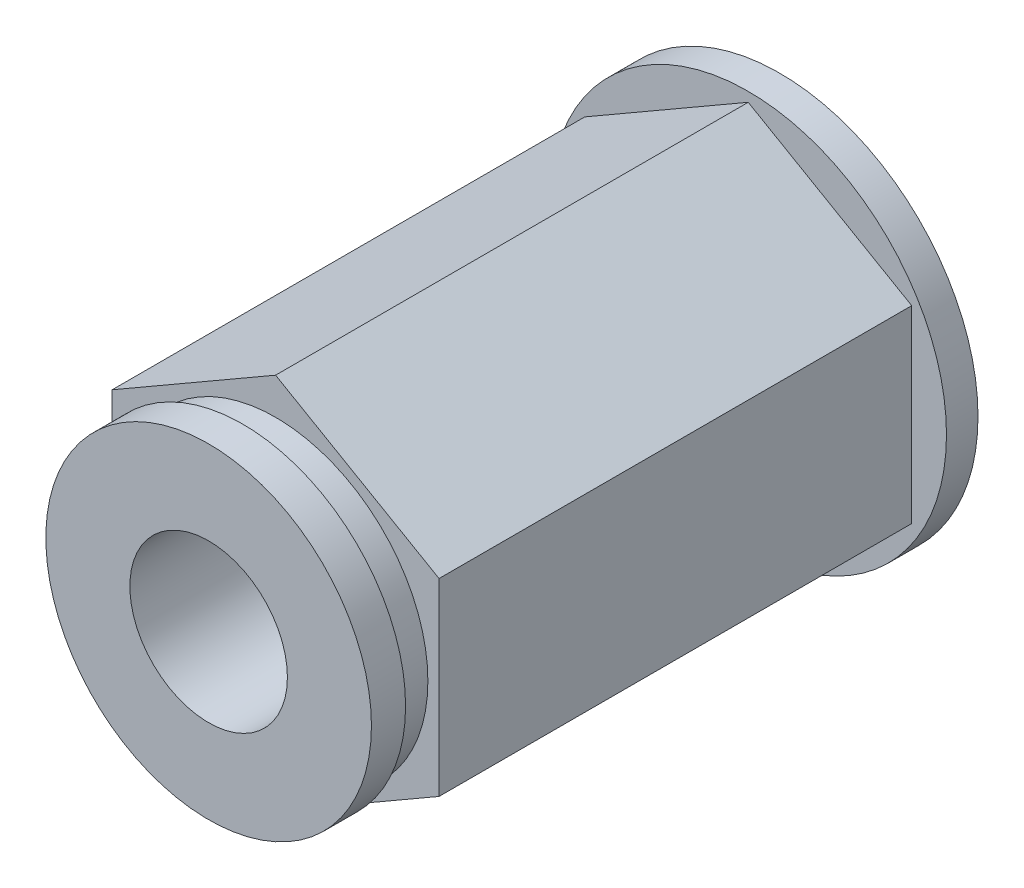
ISO-10303-21;
HEADER;
FILE_DESCRIPTION(('STEP AP214'),'2;1');
FILE_NAME('part.step','',(''),(''),'','','');
FILE_SCHEMA(('AUTOMOTIVE_DESIGN { 1 0 10303 214 1 1 1 1 }'));
ENDSEC;
DATA;
#1=APPLICATION_CONTEXT('core data for automotive mechanical design processes');
#2=APPLICATION_PROTOCOL_DEFINITION('international standard','automotive_design',2000,#1);
#3=PRODUCT_CONTEXT('',#1,'mechanical');
#4=PRODUCT('Part','Part','',(#3));
#5=PRODUCT_RELATED_PRODUCT_CATEGORY('part','',(#4));
#6=PRODUCT_DEFINITION_FORMATION('','',#4);
#7=PRODUCT_DEFINITION_CONTEXT('part definition',#1,'design');
#8=PRODUCT_DEFINITION('design','',#6,#7);
#9=PRODUCT_DEFINITION_SHAPE('','',#8);
#10=(LENGTH_UNIT() NAMED_UNIT(*) SI_UNIT(.MILLI.,.METRE.));
#11=(NAMED_UNIT(*) PLANE_ANGLE_UNIT() SI_UNIT($,.RADIAN.));
#12=(NAMED_UNIT(*) SI_UNIT($,.STERADIAN.) SOLID_ANGLE_UNIT());
#13=UNCERTAINTY_MEASURE_WITH_UNIT(LENGTH_MEASURE(1.E-05),#10,'distance_accuracy_value','');
#14=(GEOMETRIC_REPRESENTATION_CONTEXT(3) GLOBAL_UNCERTAINTY_ASSIGNED_CONTEXT((#13)) GLOBAL_UNIT_ASSIGNED_CONTEXT((#10,
#11,#12)) REPRESENTATION_CONTEXT('',''));
#15=CARTESIAN_POINT('',(0.,0.,0.));
#16=DIRECTION('',(0.,0.,1.));
#17=DIRECTION('',(1.,0.,0.));
#18=AXIS2_PLACEMENT_3D('',#15,#16,#17);
#19=CARTESIAN_POINT('',(6.225,-3.59400542570542,19.2));
#20=DIRECTION('',(0.,0.,1.));
#21=DIRECTION('',(1.,0.,0.));
#22=AXIS2_PLACEMENT_3D('',#19,#20,#21);
#23=PLANE('',#22);
#24=DIRECTION('',(0.866025403784439,0.5,0.));
#25=VECTOR('',#24,1.);
#26=CARTESIAN_POINT('',(0.,-7.18801085141084,19.2));
#27=LINE('',#26,#25);
#28=CARTESIAN_POINT('',(0.,-7.18801085141084,19.2));
#29=VERTEX_POINT('',#28);
#30=CARTESIAN_POINT('',(6.225,-3.59400542570542,19.2));
#31=VERTEX_POINT('',#30);
#32=EDGE_CURVE('E129',#29,#31,#27,.T.);
#33=ORIENTED_EDGE('',*,*,#32,.T.);
#34=DIRECTION('',(0.,1.,0.));
#35=VECTOR('',#34,1.);
#36=CARTESIAN_POINT('',(6.225,-3.59400542570542,19.2));
#37=LINE('',#36,#35);
#38=CARTESIAN_POINT('',(6.225,3.59400542570543,19.2));
#39=VERTEX_POINT('',#38);
#40=EDGE_CURVE('E84',#31,#39,#37,.T.);
#41=ORIENTED_EDGE('',*,*,#40,.T.);
#42=DIRECTION('',(-0.866025403784439,0.5,0.));
#43=VECTOR('',#42,1.);
#44=CARTESIAN_POINT('',(6.225,3.59400542570543,19.2));
#45=LINE('',#44,#43);
#46=CARTESIAN_POINT('',(0.,7.18801085141084,19.2));
#47=VERTEX_POINT('',#46);
#48=EDGE_CURVE('E97',#39,#47,#45,.T.);
#49=ORIENTED_EDGE('',*,*,#48,.T.);
#50=DIRECTION('',(-0.866025403784439,-0.5,0.));
#51=VECTOR('',#50,1.);
#52=CARTESIAN_POINT('',(0.,7.18801085141084,19.2));
#53=LINE('',#52,#51);
#54=CARTESIAN_POINT('',(-6.225,3.59400542570542,19.2));
#55=VERTEX_POINT('',#54);
#56=EDGE_CURVE('E91',#47,#55,#53,.T.);
#57=ORIENTED_EDGE('',*,*,#56,.T.);
#58=DIRECTION('',(0.,-1.,0.));
#59=VECTOR('',#58,1.);
#60=CARTESIAN_POINT('',(-6.225,3.59400542570542,19.2));
#61=LINE('',#60,#59);
#62=CARTESIAN_POINT('',(-6.225,-3.59400542570542,19.2));
#63=VERTEX_POINT('',#62);
#64=EDGE_CURVE('E95',#55,#63,#61,.T.);
#65=ORIENTED_EDGE('',*,*,#64,.T.);
#66=DIRECTION('',(0.866025403784438,-0.5,0.));
#67=VECTOR('',#66,1.);
#68=CARTESIAN_POINT('',(-6.225,-3.59400542570542,19.2));
#69=LINE('',#68,#67);
#70=EDGE_CURVE('E56',#63,#29,#69,.T.);
#71=ORIENTED_EDGE('',*,*,#70,.T.);
#72=EDGE_LOOP('',(#33,#41,#49,#57,#65,#71));
#73=FACE_BOUND('',#72,.T.);
#74=CARTESIAN_POINT('',(0.,0.,19.2));
#75=DIRECTION('',(0.,0.,1.));
#76=DIRECTION('',(1.,0.,0.));
#77=AXIS2_PLACEMENT_3D('',#74,#75,#76);
#78=CIRCLE('',#77,5.8);
#79=CARTESIAN_POINT('',(5.8,0.,19.2));
#80=VERTEX_POINT('',#79);
#81=EDGE_CURVE('E189',#80,#80,#78,.T.);
#82=ORIENTED_EDGE('',*,*,#81,.F.);
#83=EDGE_LOOP('',(#82));
#84=FACE_BOUND('',#83,.T.);
#85=ADVANCED_FACE('F33',(#73,#84),#23,.T.);
#86=CARTESIAN_POINT('',(0.,0.,1.2));
#87=DIRECTION('',(0.,0.,1.));
#88=DIRECTION('',(1.,0.,0.));
#89=AXIS2_PLACEMENT_3D('',#86,#87,#88);
#90=PLANE('',#89);
#91=CARTESIAN_POINT('',(0.,0.,1.2));
#92=DIRECTION('',(0.,0.,1.));
#93=DIRECTION('',(1.,0.,0.));
#94=AXIS2_PLACEMENT_3D('',#91,#92,#93);
#95=CIRCLE('',#94,7.55);
#96=CARTESIAN_POINT('',(7.55,0.,1.2));
#97=VERTEX_POINT('',#96);
#98=EDGE_CURVE('E11',#97,#97,#95,.T.);
#99=ORIENTED_EDGE('',*,*,#98,.T.);
#100=EDGE_LOOP('',(#99));
#101=FACE_BOUND('',#100,.T.);
#102=DIRECTION('',(0.,1.,0.));
#103=VECTOR('',#102,1.);
#104=CARTESIAN_POINT('',(6.225,-3.59400542570542,1.2));
#105=LINE('',#104,#103);
#106=CARTESIAN_POINT('',(6.225,-3.59400542570542,1.2));
#107=VERTEX_POINT('',#106);
#108=CARTESIAN_POINT('',(6.225,3.59400542570543,1.2));
#109=VERTEX_POINT('',#108);
#110=EDGE_CURVE('E120',#107,#109,#105,.T.);
#111=ORIENTED_EDGE('',*,*,#110,.F.);
#112=DIRECTION('',(0.866025403784439,0.5,0.));
#113=VECTOR('',#112,1.);
#114=CARTESIAN_POINT('',(0.,-7.18801085141084,1.2));
#115=LINE('',#114,#113);
#116=CARTESIAN_POINT('',(0.,-7.18801085141084,1.2));
#117=VERTEX_POINT('',#116);
#118=EDGE_CURVE('E117',#117,#107,#115,.T.);
#119=ORIENTED_EDGE('',*,*,#118,.F.);
#120=DIRECTION('',(0.866025403784438,-0.5,0.));
#121=VECTOR('',#120,1.);
#122=CARTESIAN_POINT('',(-6.225,-3.59400542570542,1.2));
#123=LINE('',#122,#121);
#124=CARTESIAN_POINT('',(-6.225,-3.59400542570542,1.2));
#125=VERTEX_POINT('',#124);
#126=EDGE_CURVE('E76',#125,#117,#123,.T.);
#127=ORIENTED_EDGE('',*,*,#126,.F.);
#128=DIRECTION('',(0.,-1.,0.));
#129=VECTOR('',#128,1.);
#130=CARTESIAN_POINT('',(-6.225,3.59400542570542,1.2));
#131=LINE('',#130,#129);
#132=CARTESIAN_POINT('',(-6.225,3.59400542570542,1.2));
#133=VERTEX_POINT('',#132);
#134=EDGE_CURVE('E126',#133,#125,#131,.T.);
#135=ORIENTED_EDGE('',*,*,#134,.F.);
#136=DIRECTION('',(-0.866025403784439,-0.5,0.));
#137=VECTOR('',#136,1.);
#138=CARTESIAN_POINT('',(0.,7.18801085141084,1.2));
#139=LINE('',#138,#137);
#140=CARTESIAN_POINT('',(0.,7.18801085141084,1.2));
#141=VERTEX_POINT('',#140);
#142=EDGE_CURVE('E106',#141,#133,#139,.T.);
#143=ORIENTED_EDGE('',*,*,#142,.F.);
#144=DIRECTION('',(-0.866025403784439,0.5,0.));
#145=VECTOR('',#144,1.);
#146=CARTESIAN_POINT('',(6.225,3.59400542570543,1.2));
#147=LINE('',#146,#145);
#148=EDGE_CURVE('E123',#109,#141,#147,.T.);
#149=ORIENTED_EDGE('',*,*,#148,.F.);
#150=EDGE_LOOP('',(#111,#119,#127,#135,#143,#149));
#151=FACE_BOUND('',#150,.T.);
#152=ADVANCED_FACE('F153',(#101,#151),#90,.T.);
#153=CARTESIAN_POINT('',(0.,0.,1.2));
#154=DIRECTION('',(0.,0.,-1.));
#155=DIRECTION('',(-1.,0.,0.));
#156=AXIS2_PLACEMENT_3D('',#153,#154,#155);
#157=CYLINDRICAL_SURFACE('',#156,7.55);
#158=ORIENTED_EDGE('',*,*,#98,.F.);
#159=EDGE_LOOP('',(#158));
#160=FACE_BOUND('',#159,.T.);
#161=CARTESIAN_POINT('',(0.,0.,0.));
#162=DIRECTION('',(0.,0.,1.));
#163=DIRECTION('',(1.,0.,0.));
#164=AXIS2_PLACEMENT_3D('',#161,#162,#163);
#165=CIRCLE('',#164,7.55);
#166=CARTESIAN_POINT('',(7.55,0.,0.));
#167=VERTEX_POINT('',#166);
#168=EDGE_CURVE('E37',#167,#167,#165,.T.);
#169=ORIENTED_EDGE('',*,*,#168,.T.);
#170=EDGE_LOOP('',(#169));
#171=FACE_BOUND('',#170,.T.);
#172=ADVANCED_FACE('F35',(#160,#171),#157,.T.);
#173=CARTESIAN_POINT('',(0.,0.,0.));
#174=DIRECTION('',(0.,0.,1.));
#175=DIRECTION('',(1.,0.,0.));
#176=AXIS2_PLACEMENT_3D('',#173,#174,#175);
#177=PLANE('',#176);
#178=CARTESIAN_POINT('',(0.,0.,0.));
#179=DIRECTION('',(0.,0.,1.));
#180=DIRECTION('',(1.,0.,0.));
#181=AXIS2_PLACEMENT_3D('',#178,#179,#180);
#182=CIRCLE('',#181,3.);
#183=CARTESIAN_POINT('',(3.,0.,0.));
#184=VERTEX_POINT('',#183);
#185=EDGE_CURVE('E198',#184,#184,#182,.T.);
#186=ORIENTED_EDGE('',*,*,#185,.T.);
#187=EDGE_LOOP('',(#186));
#188=FACE_BOUND('',#187,.T.);
#189=ORIENTED_EDGE('',*,*,#168,.F.);
#190=EDGE_LOOP('',(#189));
#191=FACE_BOUND('',#190,.T.);
#192=ADVANCED_FACE('F142',(#188,#191),#177,.F.);
#193=CARTESIAN_POINT('',(0.,-7.18801085141084,19.2));
#194=DIRECTION('',(-0.5,0.866025403784439,0.));
#195=DIRECTION('',(-0.866025403784439,-0.5,0.));
#196=AXIS2_PLACEMENT_3D('',#193,#194,#195);
#197=PLANE('',#196);
#198=ORIENTED_EDGE('',*,*,#118,.T.);
#199=DIRECTION('',(0.,0.,-1.));
#200=VECTOR('',#199,1.);
#201=CARTESIAN_POINT('',(6.225,-3.59400542570542,19.2));
#202=LINE('',#201,#200);
#203=EDGE_CURVE('E136',#31,#107,#202,.T.);
#204=ORIENTED_EDGE('',*,*,#203,.F.);
#205=ORIENTED_EDGE('',*,*,#32,.F.);
#206=DIRECTION('',(0.,0.,-1.));
#207=VECTOR('',#206,1.);
#208=CARTESIAN_POINT('',(0.,-7.18801085141084,19.2));
#209=LINE('',#208,#207);
#210=EDGE_CURVE('E113',#29,#117,#209,.T.);
#211=ORIENTED_EDGE('',*,*,#210,.T.);
#212=EDGE_LOOP('',(#198,#204,#205,#211));
#213=FACE_BOUND('',#212,.T.);
#214=ADVANCED_FACE('F144',(#213),#197,.F.);
#215=CARTESIAN_POINT('',(6.225,-3.59400542570542,19.2));
#216=DIRECTION('',(-1.,0.,0.));
#217=DIRECTION('',(0.,-1.,0.));
#218=AXIS2_PLACEMENT_3D('',#215,#216,#217);
#219=PLANE('',#218);
#220=ORIENTED_EDGE('',*,*,#110,.T.);
#221=DIRECTION('',(0.,0.,-1.));
#222=VECTOR('',#221,1.);
#223=CARTESIAN_POINT('',(6.225,3.59400542570543,19.2));
#224=LINE('',#223,#222);
#225=EDGE_CURVE('E133',#39,#109,#224,.T.);
#226=ORIENTED_EDGE('',*,*,#225,.F.);
#227=ORIENTED_EDGE('',*,*,#40,.F.);
#228=ORIENTED_EDGE('',*,*,#203,.T.);
#229=EDGE_LOOP('',(#220,#226,#227,#228));
#230=FACE_BOUND('',#229,.T.);
#231=ADVANCED_FACE('F150',(#230),#219,.F.);
#232=CARTESIAN_POINT('',(6.225,3.59400542570543,19.2));
#233=DIRECTION('',(-0.5,-0.866025403784439,0.));
#234=DIRECTION('',(0.866025403784439,-0.5,0.));
#235=AXIS2_PLACEMENT_3D('',#232,#233,#234);
#236=PLANE('',#235);
#237=ORIENTED_EDGE('',*,*,#148,.T.);
#238=DIRECTION('',(0.,0.,-1.));
#239=VECTOR('',#238,1.);
#240=CARTESIAN_POINT('',(0.,7.18801085141084,19.2));
#241=LINE('',#240,#239);
#242=EDGE_CURVE('E109',#47,#141,#241,.T.);
#243=ORIENTED_EDGE('',*,*,#242,.F.);
#244=ORIENTED_EDGE('',*,*,#48,.F.);
#245=ORIENTED_EDGE('',*,*,#225,.T.);
#246=EDGE_LOOP('',(#237,#243,#244,#245));
#247=FACE_BOUND('',#246,.T.);
#248=ADVANCED_FACE('F174',(#247),#236,.F.);
#249=CARTESIAN_POINT('',(0.,7.18801085141084,19.2));
#250=DIRECTION('',(0.5,-0.866025403784439,0.));
#251=DIRECTION('',(0.866025403784439,0.5,0.));
#252=AXIS2_PLACEMENT_3D('',#249,#250,#251);
#253=PLANE('',#252);
#254=ORIENTED_EDGE('',*,*,#142,.T.);
#255=DIRECTION('',(0.,0.,-1.));
#256=VECTOR('',#255,1.);
#257=CARTESIAN_POINT('',(-6.225,3.59400542570542,19.2));
#258=LINE('',#257,#256);
#259=EDGE_CURVE('E103',#55,#133,#258,.T.);
#260=ORIENTED_EDGE('',*,*,#259,.F.);
#261=ORIENTED_EDGE('',*,*,#56,.F.);
#262=ORIENTED_EDGE('',*,*,#242,.T.);
#263=EDGE_LOOP('',(#254,#260,#261,#262));
#264=FACE_BOUND('',#263,.T.);
#265=ADVANCED_FACE('F104',(#264),#253,.F.);
#266=CARTESIAN_POINT('',(-6.225,3.59400542570542,19.2));
#267=DIRECTION('',(1.,0.,0.));
#268=DIRECTION('',(0.,0.,-1.));
#269=AXIS2_PLACEMENT_3D('',#266,#267,#268);
#270=PLANE('',#269);
#271=ORIENTED_EDGE('',*,*,#134,.T.);
#272=DIRECTION('',(0.,0.,-1.));
#273=VECTOR('',#272,1.);
#274=CARTESIAN_POINT('',(-6.225,-3.59400542570542,19.2));
#275=LINE('',#274,#273);
#276=EDGE_CURVE('E48',#63,#125,#275,.T.);
#277=ORIENTED_EDGE('',*,*,#276,.F.);
#278=ORIENTED_EDGE('',*,*,#64,.F.);
#279=ORIENTED_EDGE('',*,*,#259,.T.);
#280=EDGE_LOOP('',(#271,#277,#278,#279));
#281=FACE_BOUND('',#280,.T.);
#282=ADVANCED_FACE('F111',(#281),#270,.F.);
#283=CARTESIAN_POINT('',(-6.225,-3.59400542570542,19.2));
#284=DIRECTION('',(0.5,0.866025403784439,0.));
#285=DIRECTION('',(-0.866025403784439,0.5,0.));
#286=AXIS2_PLACEMENT_3D('',#283,#284,#285);
#287=PLANE('',#286);
#288=ORIENTED_EDGE('',*,*,#126,.T.);
#289=ORIENTED_EDGE('',*,*,#210,.F.);
#290=ORIENTED_EDGE('',*,*,#70,.F.);
#291=ORIENTED_EDGE('',*,*,#276,.T.);
#292=EDGE_LOOP('',(#288,#289,#290,#291));
#293=FACE_BOUND('',#292,.T.);
#294=ADVANCED_FACE('F167',(#293),#287,.F.);
#295=CARTESIAN_POINT('',(0.,0.,20.45));
#296=DIRECTION('',(0.,0.,-1.));
#297=DIRECTION('',(-1.,0.,0.));
#298=AXIS2_PLACEMENT_3D('',#295,#296,#297);
#299=CYLINDRICAL_SURFACE('',#298,5.8);
#300=CARTESIAN_POINT('',(0.,0.,20.45));
#301=DIRECTION('',(0.,0.,1.));
#302=DIRECTION('',(1.,0.,0.));
#303=AXIS2_PLACEMENT_3D('',#300,#301,#302);
#304=CIRCLE('',#303,5.8);
#305=CARTESIAN_POINT('',(5.8,0.,20.45));
#306=VERTEX_POINT('',#305);
#307=EDGE_CURVE('E121',#306,#306,#304,.T.);
#308=ORIENTED_EDGE('',*,*,#307,.F.);
#309=EDGE_LOOP('',(#308));
#310=FACE_BOUND('',#309,.T.);
#311=ORIENTED_EDGE('',*,*,#81,.T.);
#312=EDGE_LOOP('',(#311));
#313=FACE_BOUND('',#312,.T.);
#314=ADVANCED_FACE('F165',(#310,#313),#299,.T.);
#315=CARTESIAN_POINT('',(0.,0.,20.45));
#316=DIRECTION('',(0.,0.,1.));
#317=DIRECTION('',(1.,0.,0.));
#318=AXIS2_PLACEMENT_3D('',#315,#316,#317);
#319=PLANE('',#318);
#320=CARTESIAN_POINT('',(0.,0.,20.45));
#321=DIRECTION('',(0.,0.,1.));
#322=DIRECTION('',(1.,0.,0.));
#323=AXIS2_PLACEMENT_3D('',#320,#321,#322);
#324=CIRCLE('',#323,6.2);
#325=CARTESIAN_POINT('',(6.2,0.,20.45));
#326=VERTEX_POINT('',#325);
#327=EDGE_CURVE('E195',#326,#326,#324,.T.);
#328=ORIENTED_EDGE('',*,*,#327,.F.);
#329=EDGE_LOOP('',(#328));
#330=FACE_BOUND('',#329,.T.);
#331=ORIENTED_EDGE('',*,*,#307,.T.);
#332=EDGE_LOOP('',(#331));
#333=FACE_BOUND('',#332,.T.);
#334=ADVANCED_FACE('F221',(#330,#333),#319,.F.);
#335=CARTESIAN_POINT('',(0.,0.,21.75));
#336=DIRECTION('',(0.,0.,-1.));
#337=DIRECTION('',(-1.,0.,0.));
#338=AXIS2_PLACEMENT_3D('',#335,#336,#337);
#339=CYLINDRICAL_SURFACE('',#338,6.2);
#340=CARTESIAN_POINT('',(0.,0.,21.75));
#341=DIRECTION('',(0.,0.,1.));
#342=DIRECTION('',(1.,0.,0.));
#343=AXIS2_PLACEMENT_3D('',#340,#341,#342);
#344=CIRCLE('',#343,6.2);
#345=CARTESIAN_POINT('',(6.2,0.,21.75));
#346=VERTEX_POINT('',#345);
#347=EDGE_CURVE('E192',#346,#346,#344,.T.);
#348=ORIENTED_EDGE('',*,*,#347,.F.);
#349=EDGE_LOOP('',(#348));
#350=FACE_BOUND('',#349,.T.);
#351=ORIENTED_EDGE('',*,*,#327,.T.);
#352=EDGE_LOOP('',(#351));
#353=FACE_BOUND('',#352,.T.);
#354=ADVANCED_FACE('F215',(#350,#353),#339,.T.);
#355=CARTESIAN_POINT('',(0.,0.,21.75));
#356=DIRECTION('',(0.,0.,1.));
#357=DIRECTION('',(1.,0.,0.));
#358=AXIS2_PLACEMENT_3D('',#355,#356,#357);
#359=PLANE('',#358);
#360=CARTESIAN_POINT('',(0.,0.,21.75));
#361=DIRECTION('',(0.,0.,1.));
#362=DIRECTION('',(1.,0.,0.));
#363=AXIS2_PLACEMENT_3D('',#360,#361,#362);
#364=CIRCLE('',#363,3.);
#365=CARTESIAN_POINT('',(3.,0.,21.75));
#366=VERTEX_POINT('',#365);
#367=EDGE_CURVE('E201',#366,#366,#364,.T.);
#368=ORIENTED_EDGE('',*,*,#367,.F.);
#369=EDGE_LOOP('',(#368));
#370=FACE_BOUND('',#369,.T.);
#371=ORIENTED_EDGE('',*,*,#347,.T.);
#372=EDGE_LOOP('',(#371));
#373=FACE_BOUND('',#372,.T.);
#374=ADVANCED_FACE('F209',(#370,#373),#359,.T.);
#375=CARTESIAN_POINT('',(0.,0.,0.));
#376=DIRECTION('',(0.,0.,1.));
#377=DIRECTION('',(1.,0.,0.));
#378=AXIS2_PLACEMENT_3D('',#375,#376,#377);
#379=CYLINDRICAL_SURFACE('',#378,3.);
#380=ORIENTED_EDGE('',*,*,#185,.F.);
#381=EDGE_LOOP('',(#380));
#382=FACE_BOUND('',#381,.T.);
#383=ORIENTED_EDGE('',*,*,#367,.T.);
#384=EDGE_LOOP('',(#383));
#385=FACE_BOUND('',#384,.T.);
#386=ADVANCED_FACE('F206',(#382,#385),#379,.F.);
#387=CLOSED_SHELL('',(#85,#152,#172,#192,#214,#231,#248,#265,#282,#294,#314,#334,#354,#374,#386));
#388=MANIFOLD_SOLID_BREP('B2',#387);
#389=ADVANCED_BREP_SHAPE_REPRESENTATION('',(#18,#388),#14);
#390=SHAPE_DEFINITION_REPRESENTATION(#9,#389);
ENDSEC;
END-ISO-10303-21;
